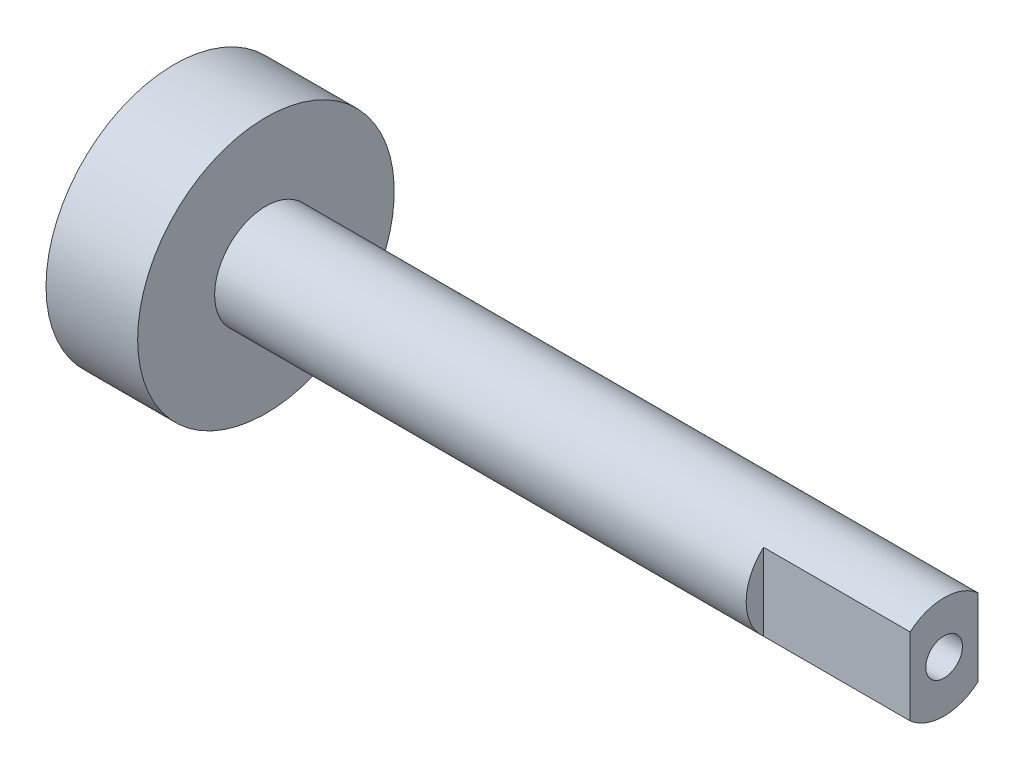
ISO-10303-21;
HEADER;
FILE_DESCRIPTION(('STEP AP214'),'2;1');
FILE_NAME('part.step','',(''),(''),'','','');
FILE_SCHEMA(('AUTOMOTIVE_DESIGN { 1 0 10303 214 1 1 1 1 }'));
ENDSEC;
DATA;
#1=APPLICATION_CONTEXT('core data for automotive mechanical design processes');
#2=APPLICATION_PROTOCOL_DEFINITION('international standard','automotive_design',2000,#1);
#3=PRODUCT_CONTEXT('',#1,'mechanical');
#4=PRODUCT('Part','Part','',(#3));
#5=PRODUCT_RELATED_PRODUCT_CATEGORY('part','',(#4));
#6=PRODUCT_DEFINITION_FORMATION('','',#4);
#7=PRODUCT_DEFINITION_CONTEXT('part definition',#1,'design');
#8=PRODUCT_DEFINITION('design','',#6,#7);
#9=PRODUCT_DEFINITION_SHAPE('','',#8);
#10=(LENGTH_UNIT() NAMED_UNIT(*) SI_UNIT(.MILLI.,.METRE.));
#11=(NAMED_UNIT(*) PLANE_ANGLE_UNIT() SI_UNIT($,.RADIAN.));
#12=(NAMED_UNIT(*) SI_UNIT($,.STERADIAN.) SOLID_ANGLE_UNIT());
#13=UNCERTAINTY_MEASURE_WITH_UNIT(LENGTH_MEASURE(1.E-05),#10,'distance_accuracy_value','');
#14=(GEOMETRIC_REPRESENTATION_CONTEXT(3) GLOBAL_UNCERTAINTY_ASSIGNED_CONTEXT((#13)) GLOBAL_UNIT_ASSIGNED_CONTEXT((#10,
#11,#12)) REPRESENTATION_CONTEXT('',''));
#15=CARTESIAN_POINT('',(0.,0.,0.));
#16=DIRECTION('',(0.,0.,1.));
#17=DIRECTION('',(1.,0.,0.));
#18=AXIS2_PLACEMENT_3D('',#15,#16,#17);
#19=CARTESIAN_POINT('',(18.5,0.,0.));
#20=DIRECTION('',(-1.,0.,0.));
#21=DIRECTION('',(0.,0.,1.));
#22=AXIS2_PLACEMENT_3D('',#19,#20,#21);
#23=CYLINDRICAL_SURFACE('',#22,2.8);
#24=CARTESIAN_POINT('',(18.5,0.,0.));
#25=DIRECTION('',(1.,0.,0.));
#26=DIRECTION('',(0.,0.,-1.));
#27=AXIS2_PLACEMENT_3D('',#24,#25,#26);
#28=CIRCLE('',#27,2.8);
#29=CARTESIAN_POINT('',(18.5,-2.10178495569837,1.85));
#30=VERTEX_POINT('',#29);
#31=CARTESIAN_POINT('',(18.5,-2.10178495569837,-1.85));
#32=VERTEX_POINT('',#31);
#33=EDGE_CURVE('E53',#30,#32,#28,.T.);
#34=ORIENTED_EDGE('',*,*,#33,.F.);
#35=DIRECTION('',(1.,0.,0.));
#36=VECTOR('',#35,1.);
#37=CARTESIAN_POINT('',(10.5,-2.10178495569837,1.85));
#38=LINE('',#37,#36);
#39=CARTESIAN_POINT('',(10.5,-2.10178495569837,1.85));
#40=VERTEX_POINT('',#39);
#41=EDGE_CURVE('E60',#40,#30,#38,.T.);
#42=ORIENTED_EDGE('',*,*,#41,.F.);
#43=CARTESIAN_POINT('',(10.5,0.,0.));
#44=DIRECTION('',(1.,0.,0.));
#45=DIRECTION('',(0.,0.,-1.));
#46=AXIS2_PLACEMENT_3D('',#43,#44,#45);
#47=CIRCLE('',#46,2.8);
#48=CARTESIAN_POINT('',(10.5,2.10178495569837,1.85));
#49=VERTEX_POINT('',#48);
#50=EDGE_CURVE('E88',#49,#40,#47,.T.);
#51=ORIENTED_EDGE('',*,*,#50,.F.);
#52=DIRECTION('',(1.,0.,0.));
#53=VECTOR('',#52,1.);
#54=CARTESIAN_POINT('',(10.5,2.10178495569837,1.85));
#55=LINE('',#54,#53);
#56=CARTESIAN_POINT('',(18.5,2.10178495569837,1.85));
#57=VERTEX_POINT('',#56);
#58=EDGE_CURVE('E96',#49,#57,#55,.T.);
#59=ORIENTED_EDGE('',*,*,#58,.T.);
#60=CARTESIAN_POINT('',(18.5,2.10178495569837,-1.85));
#61=VERTEX_POINT('',#60);
#62=EDGE_CURVE('E11',#61,#57,#28,.T.);
#63=ORIENTED_EDGE('',*,*,#62,.F.);
#64=DIRECTION('',(1.,0.,0.));
#65=VECTOR('',#64,1.);
#66=CARTESIAN_POINT('',(10.5,2.10178495569837,-1.85));
#67=LINE('',#66,#65);
#68=CARTESIAN_POINT('',(10.5,2.10178495569837,-1.85));
#69=VERTEX_POINT('',#68);
#70=EDGE_CURVE('E68',#69,#61,#67,.T.);
#71=ORIENTED_EDGE('',*,*,#70,.F.);
#72=CARTESIAN_POINT('',(10.5,0.,0.));
#73=DIRECTION('',(1.,0.,0.));
#74=DIRECTION('',(0.,0.,-1.));
#75=AXIS2_PLACEMENT_3D('',#72,#73,#74);
#76=CIRCLE('',#75,2.8);
#77=CARTESIAN_POINT('',(10.5,-2.10178495569837,-1.85));
#78=VERTEX_POINT('',#77);
#79=EDGE_CURVE('E106',#78,#69,#76,.T.);
#80=ORIENTED_EDGE('',*,*,#79,.F.);
#81=DIRECTION('',(1.,0.,0.));
#82=VECTOR('',#81,1.);
#83=CARTESIAN_POINT('',(10.5,-2.10178495569837,-1.85));
#84=LINE('',#83,#82);
#85=EDGE_CURVE('E114',#78,#32,#84,.T.);
#86=ORIENTED_EDGE('',*,*,#85,.T.);
#87=EDGE_LOOP('',(#34,#42,#51,#59,#63,#71,#80,#86));
#88=FACE_BOUND('',#87,.T.);
#89=CARTESIAN_POINT('',(-18.5,0.,0.));
#90=DIRECTION('',(1.,0.,0.));
#91=DIRECTION('',(0.,0.,-1.));
#92=AXIS2_PLACEMENT_3D('',#89,#90,#91);
#93=CIRCLE('',#92,2.8);
#94=CARTESIAN_POINT('',(-18.5,0.,-2.8));
#95=VERTEX_POINT('',#94);
#96=EDGE_CURVE('E48',#95,#95,#93,.T.);
#97=ORIENTED_EDGE('',*,*,#96,.T.);
#98=EDGE_LOOP('',(#97));
#99=FACE_BOUND('',#98,.T.);
#100=ADVANCED_FACE('F45',(#88,#99),#23,.T.);
#101=CARTESIAN_POINT('',(18.5,0.,0.));
#102=DIRECTION('',(1.,0.,0.));
#103=DIRECTION('',(0.,0.,-1.));
#104=AXIS2_PLACEMENT_3D('',#101,#102,#103);
#105=PLANE('',#104);
#106=CARTESIAN_POINT('',(18.5,0.,0.));
#107=DIRECTION('',(1.,0.,0.));
#108=DIRECTION('',(0.,0.,-1.));
#109=AXIS2_PLACEMENT_3D('',#106,#107,#108);
#110=CIRCLE('',#109,1.);
#111=CARTESIAN_POINT('',(18.5,0.,-1.));
#112=VERTEX_POINT('',#111);
#113=EDGE_CURVE('E118',#112,#112,#110,.T.);
#114=ORIENTED_EDGE('',*,*,#113,.F.);
#115=EDGE_LOOP('',(#114));
#116=FACE_BOUND('',#115,.T.);
#117=DIRECTION('',(0.,1.,0.));
#118=VECTOR('',#117,1.);
#119=CARTESIAN_POINT('',(18.5,2.10178495569837,1.85));
#120=LINE('',#119,#118);
#121=EDGE_CURVE('E93',#30,#57,#120,.T.);
#122=ORIENTED_EDGE('',*,*,#121,.F.);
#123=ORIENTED_EDGE('',*,*,#33,.T.);
#124=DIRECTION('',(0.,-1.,0.));
#125=VECTOR('',#124,1.);
#126=CARTESIAN_POINT('',(18.5,2.10178495569837,-1.85));
#127=LINE('',#126,#125);
#128=EDGE_CURVE('E109',#61,#32,#127,.T.);
#129=ORIENTED_EDGE('',*,*,#128,.F.);
#130=ORIENTED_EDGE('',*,*,#62,.T.);
#131=EDGE_LOOP('',(#122,#123,#129,#130));
#132=FACE_BOUND('',#131,.T.);
#133=ADVANCED_FACE('F154',(#116,#132),#105,.T.);
#134=CARTESIAN_POINT('',(10.5,2.10178495569837,-1.85));
#135=DIRECTION('',(0.,0.,1.));
#136=DIRECTION('',(1.,0.,0.));
#137=AXIS2_PLACEMENT_3D('',#134,#135,#136);
#138=PLANE('',#137);
#139=ORIENTED_EDGE('',*,*,#128,.T.);
#140=ORIENTED_EDGE('',*,*,#85,.F.);
#141=DIRECTION('',(0.,-1.,0.));
#142=VECTOR('',#141,1.);
#143=CARTESIAN_POINT('',(10.5,2.10178495569837,-1.85));
#144=LINE('',#143,#142);
#145=EDGE_CURVE('E108',#69,#78,#144,.T.);
#146=ORIENTED_EDGE('',*,*,#145,.F.);
#147=ORIENTED_EDGE('',*,*,#70,.T.);
#148=EDGE_LOOP('',(#139,#140,#146,#147));
#149=FACE_BOUND('',#148,.T.);
#150=ADVANCED_FACE('F159',(#149),#138,.F.);
#151=CARTESIAN_POINT('',(10.5,0.,0.));
#152=DIRECTION('',(1.,0.,0.));
#153=DIRECTION('',(0.,0.,-1.));
#154=AXIS2_PLACEMENT_3D('',#151,#152,#153);
#155=PLANE('',#154);
#156=ORIENTED_EDGE('',*,*,#79,.T.);
#157=ORIENTED_EDGE('',*,*,#145,.T.);
#158=EDGE_LOOP('',(#156,#157));
#159=FACE_BOUND('',#158,.T.);
#160=ADVANCED_FACE('F165',(#159),#155,.T.);
#161=CARTESIAN_POINT('',(10.5,2.10178495569837,1.85));
#162=DIRECTION('',(0.,0.,-1.));
#163=DIRECTION('',(-1.,0.,0.));
#164=AXIS2_PLACEMENT_3D('',#161,#162,#163);
#165=PLANE('',#164);
#166=ORIENTED_EDGE('',*,*,#121,.T.);
#167=ORIENTED_EDGE('',*,*,#58,.F.);
#168=DIRECTION('',(0.,1.,0.));
#169=VECTOR('',#168,1.);
#170=CARTESIAN_POINT('',(10.5,2.10178495569837,1.85));
#171=LINE('',#170,#169);
#172=EDGE_CURVE('E90',#40,#49,#171,.T.);
#173=ORIENTED_EDGE('',*,*,#172,.F.);
#174=ORIENTED_EDGE('',*,*,#41,.T.);
#175=EDGE_LOOP('',(#166,#167,#173,#174));
#176=FACE_BOUND('',#175,.T.);
#177=ADVANCED_FACE('F95',(#176),#165,.F.);
#178=CARTESIAN_POINT('',(10.5,0.,0.));
#179=DIRECTION('',(1.,0.,0.));
#180=DIRECTION('',(0.,0.,-1.));
#181=AXIS2_PLACEMENT_3D('',#178,#179,#180);
#182=PLANE('',#181);
#183=ORIENTED_EDGE('',*,*,#50,.T.);
#184=ORIENTED_EDGE('',*,*,#172,.T.);
#185=EDGE_LOOP('',(#183,#184));
#186=FACE_BOUND('',#185,.T.);
#187=ADVANCED_FACE('F89',(#186),#182,.T.);
#188=CARTESIAN_POINT('',(12.5,0.,0.));
#189=DIRECTION('',(1.,0.,0.));
#190=DIRECTION('',(0.,0.,-1.));
#191=AXIS2_PLACEMENT_3D('',#188,#189,#190);
#192=CYLINDRICAL_SURFACE('',#191,1.);
#193=CARTESIAN_POINT('',(12.5,0.,0.));
#194=DIRECTION('',(1.,0.,0.));
#195=DIRECTION('',(0.,0.,-1.));
#196=AXIS2_PLACEMENT_3D('',#193,#194,#195);
#197=CIRCLE('',#196,1.);
#198=CARTESIAN_POINT('',(12.5,0.,-1.));
#199=VERTEX_POINT('',#198);
#200=EDGE_CURVE('E113',#199,#199,#197,.T.);
#201=ORIENTED_EDGE('',*,*,#200,.F.);
#202=EDGE_LOOP('',(#201));
#203=FACE_BOUND('',#202,.T.);
#204=ORIENTED_EDGE('',*,*,#113,.T.);
#205=EDGE_LOOP('',(#204));
#206=FACE_BOUND('',#205,.T.);
#207=ADVANCED_FACE('F150',(#203,#206),#192,.F.);
#208=CARTESIAN_POINT('',(12.5,0.,0.));
#209=DIRECTION('',(1.,0.,0.));
#210=DIRECTION('',(0.,0.,-1.));
#211=AXIS2_PLACEMENT_3D('',#208,#209,#210);
#212=PLANE('',#211);
#213=ORIENTED_EDGE('',*,*,#200,.T.);
#214=EDGE_LOOP('',(#213));
#215=FACE_BOUND('',#214,.T.);
#216=ADVANCED_FACE('F142',(#215),#212,.T.);
#217=CARTESIAN_POINT('',(-23.5,0.,0.));
#218=DIRECTION('',(1.,0.,0.));
#219=DIRECTION('',(0.,0.,-1.));
#220=AXIS2_PLACEMENT_3D('',#217,#218,#219);
#221=CYLINDRICAL_SURFACE('',#220,7.);
#222=CARTESIAN_POINT('',(-23.5,0.,0.));
#223=DIRECTION('',(-1.,0.,0.));
#224=DIRECTION('',(0.,0.,1.));
#225=AXIS2_PLACEMENT_3D('',#222,#223,#224);
#226=CIRCLE('',#225,7.);
#227=CARTESIAN_POINT('',(-23.5,0.,7.));
#228=VERTEX_POINT('',#227);
#229=EDGE_CURVE('E126',#228,#228,#226,.T.);
#230=ORIENTED_EDGE('',*,*,#229,.F.);
#231=EDGE_LOOP('',(#230));
#232=FACE_BOUND('',#231,.T.);
#233=CARTESIAN_POINT('',(-18.5,0.,0.));
#234=DIRECTION('',(-1.,0.,0.));
#235=DIRECTION('',(0.,0.,1.));
#236=AXIS2_PLACEMENT_3D('',#233,#234,#235);
#237=CIRCLE('',#236,7.);
#238=CARTESIAN_POINT('',(-18.5,0.,7.));
#239=VERTEX_POINT('',#238);
#240=EDGE_CURVE('E123',#239,#239,#237,.T.);
#241=ORIENTED_EDGE('',*,*,#240,.T.);
#242=EDGE_LOOP('',(#241));
#243=FACE_BOUND('',#242,.T.);
#244=ADVANCED_FACE('F140',(#232,#243),#221,.T.);
#245=CARTESIAN_POINT('',(-23.5,0.,0.));
#246=DIRECTION('',(-1.,0.,0.));
#247=DIRECTION('',(0.,0.,1.));
#248=AXIS2_PLACEMENT_3D('',#245,#246,#247);
#249=PLANE('',#248);
#250=ORIENTED_EDGE('',*,*,#229,.T.);
#251=EDGE_LOOP('',(#250));
#252=FACE_BOUND('',#251,.T.);
#253=ADVANCED_FACE('F136',(#252),#249,.T.);
#254=CARTESIAN_POINT('',(-18.5,0.,0.));
#255=DIRECTION('',(-1.,0.,0.));
#256=DIRECTION('',(0.,0.,1.));
#257=AXIS2_PLACEMENT_3D('',#254,#255,#256);
#258=PLANE('',#257);
#259=ORIENTED_EDGE('',*,*,#96,.F.);
#260=EDGE_LOOP('',(#259));
#261=FACE_BOUND('',#260,.T.);
#262=ORIENTED_EDGE('',*,*,#240,.F.);
#263=EDGE_LOOP('',(#262));
#264=FACE_BOUND('',#263,.T.);
#265=ADVANCED_FACE('F133',(#261,#264),#258,.F.);
#266=CLOSED_SHELL('',(#100,#133,#150,#160,#177,#187,#207,#216,#244,#253,#265));
#267=MANIFOLD_SOLID_BREP('B2',#266);
#268=ADVANCED_BREP_SHAPE_REPRESENTATION('',(#18,#267),#14);
#269=SHAPE_DEFINITION_REPRESENTATION(#9,#268);
ENDSEC;
END-ISO-10303-21;
